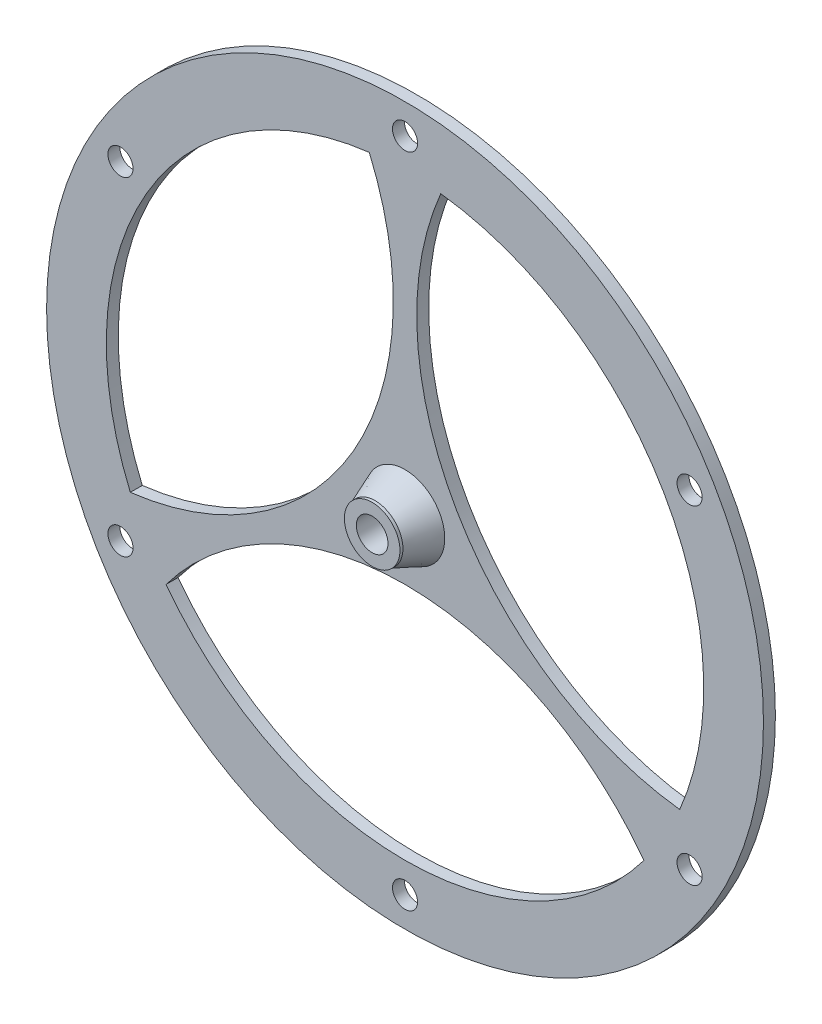
ISO-10303-21;
HEADER;
FILE_DESCRIPTION(('STEP AP214'),'2;1');
FILE_NAME('part.step','',(''),(''),'','','');
FILE_SCHEMA(('AUTOMOTIVE_DESIGN { 1 0 10303 214 1 1 1 1 }'));
ENDSEC;
DATA;
#1=APPLICATION_CONTEXT('core data for automotive mechanical design processes');
#2=APPLICATION_PROTOCOL_DEFINITION('international standard','automotive_design',2000,#1);
#3=PRODUCT_CONTEXT('',#1,'mechanical');
#4=PRODUCT('Part','Part','',(#3));
#5=PRODUCT_RELATED_PRODUCT_CATEGORY('part','',(#4));
#6=PRODUCT_DEFINITION_FORMATION('','',#4);
#7=PRODUCT_DEFINITION_CONTEXT('part definition',#1,'design');
#8=PRODUCT_DEFINITION('design','',#6,#7);
#9=PRODUCT_DEFINITION_SHAPE('','',#8);
#10=(LENGTH_UNIT() NAMED_UNIT(*) SI_UNIT(.MILLI.,.METRE.));
#11=(NAMED_UNIT(*) PLANE_ANGLE_UNIT() SI_UNIT($,.RADIAN.));
#12=(NAMED_UNIT(*) SI_UNIT($,.STERADIAN.) SOLID_ANGLE_UNIT());
#13=UNCERTAINTY_MEASURE_WITH_UNIT(LENGTH_MEASURE(1.E-05),#10,'distance_accuracy_value','');
#14=(GEOMETRIC_REPRESENTATION_CONTEXT(3) GLOBAL_UNCERTAINTY_ASSIGNED_CONTEXT((#13)) GLOBAL_UNIT_ASSIGNED_CONTEXT((#10,
#11,#12)) REPRESENTATION_CONTEXT('',''));
#15=CARTESIAN_POINT('',(0.,0.,0.));
#16=DIRECTION('',(0.,0.,1.));
#17=DIRECTION('',(1.,0.,0.));
#18=AXIS2_PLACEMENT_3D('',#15,#16,#17);
#19=CARTESIAN_POINT('',(0.,0.,2.));
#20=DIRECTION('',(0.,0.,1.));
#21=DIRECTION('',(1.,0.,0.));
#22=AXIS2_PLACEMENT_3D('',#19,#20,#21);
#23=PLANE('',#22);
#24=CARTESIAN_POINT('',(0.,0.,2.));
#25=DIRECTION('',(0.,0.,1.));
#26=DIRECTION('',(1.,0.,0.));
#27=AXIS2_PLACEMENT_3D('',#24,#25,#26);
#28=CIRCLE('',#27,6.64999999999999);
#29=CARTESIAN_POINT('',(6.64999999999999,0.,2.));
#30=VERTEX_POINT('',#29);
#31=EDGE_CURVE('E11',#30,#30,#28,.F.);
#32=ORIENTED_EDGE('',*,*,#31,.T.);
#33=EDGE_LOOP('',(#32));
#34=FACE_BOUND('',#33,.T.);
#35=CARTESIAN_POINT('',(0.,-60.,2.));
#36=DIRECTION('',(0.,0.,1.));
#37=DIRECTION('',(1.,0.,0.));
#38=AXIS2_PLACEMENT_3D('',#35,#36,#37);
#39=CIRCLE('',#38,50.);
#40=CARTESIAN_POINT('',(40.,-30.,2.));
#41=VERTEX_POINT('',#40);
#42=CARTESIAN_POINT('',(-40.,-30.,2.));
#43=VERTEX_POINT('',#42);
#44=EDGE_CURVE('E117',#41,#43,#39,.T.);
#45=ORIENTED_EDGE('',*,*,#44,.F.);
#46=CARTESIAN_POINT('',(0.,0.,2.));
#47=DIRECTION('',(0.,0.,1.));
#48=DIRECTION('',(1.,0.,0.));
#49=AXIS2_PLACEMENT_3D('',#46,#47,#48);
#50=CIRCLE('',#49,50.);
#51=EDGE_CURVE('E119',#43,#41,#50,.T.);
#52=ORIENTED_EDGE('',*,*,#51,.F.);
#53=EDGE_LOOP('',(#45,#52));
#54=FACE_BOUND('',#53,.T.);
#55=CARTESIAN_POINT('',(51.9615242270662,30.0000000000003,2.));
#56=DIRECTION('',(0.,0.,1.));
#57=DIRECTION('',(1.,0.,0.));
#58=AXIS2_PLACEMENT_3D('',#55,#56,#57);
#59=CIRCLE('',#58,50.);
#60=CARTESIAN_POINT('',(5.98076211353289,49.6410161513776,2.));
#61=VERTEX_POINT('',#60);
#62=CARTESIAN_POINT('',(45.9807621135333,-19.6410161513773,2.));
#63=VERTEX_POINT('',#62);
#64=EDGE_CURVE('E111',#61,#63,#59,.T.);
#65=ORIENTED_EDGE('',*,*,#64,.F.);
#66=CARTESIAN_POINT('',(0.,0.,2.));
#67=DIRECTION('',(0.,0.,1.));
#68=DIRECTION('',(1.,0.,0.));
#69=AXIS2_PLACEMENT_3D('',#66,#67,#68);
#70=CIRCLE('',#69,50.);
#71=EDGE_CURVE('E102',#63,#61,#70,.T.);
#72=ORIENTED_EDGE('',*,*,#71,.F.);
#73=EDGE_LOOP('',(#65,#72));
#74=FACE_BOUND('',#73,.T.);
#75=CARTESIAN_POINT('',(0.,0.,2.));
#76=DIRECTION('',(0.,0.,1.));
#77=DIRECTION('',(1.,0.,0.));
#78=AXIS2_PLACEMENT_3D('',#75,#76,#77);
#79=CIRCLE('',#78,60.);
#80=CARTESIAN_POINT('',(60.,0.,2.));
#81=VERTEX_POINT('',#80);
#82=EDGE_CURVE('E114',#81,#81,#79,.T.);
#83=ORIENTED_EDGE('',*,*,#82,.T.);
#84=EDGE_LOOP('',(#83));
#85=FACE_BOUND('',#84,.T.);
#86=CARTESIAN_POINT('',(-51.9615242270666,29.9999999999995,2.));
#87=DIRECTION('',(0.,0.,1.));
#88=DIRECTION('',(1.,0.,0.));
#89=AXIS2_PLACEMENT_3D('',#86,#87,#88);
#90=CIRCLE('',#89,50.);
#91=CARTESIAN_POINT('',(-45.980762113533,-19.641016151378,2.));
#92=VERTEX_POINT('',#91);
#93=CARTESIAN_POINT('',(-5.98076211353365,49.6410161513775,2.));
#94=VERTEX_POINT('',#93);
#95=EDGE_CURVE('E146',#92,#94,#90,.T.);
#96=ORIENTED_EDGE('',*,*,#95,.F.);
#97=CARTESIAN_POINT('',(0.,0.,2.));
#98=DIRECTION('',(0.,0.,1.));
#99=DIRECTION('',(1.,0.,0.));
#100=AXIS2_PLACEMENT_3D('',#97,#98,#99);
#101=CIRCLE('',#100,50.);
#102=EDGE_CURVE('E209',#94,#92,#101,.T.);
#103=ORIENTED_EDGE('',*,*,#102,.F.);
#104=EDGE_LOOP('',(#96,#103));
#105=FACE_BOUND('',#104,.T.);
#106=CARTESIAN_POINT('',(0.,55.,2.));
#107=DIRECTION('',(0.,0.,1.));
#108=DIRECTION('',(1.,0.,0.));
#109=AXIS2_PLACEMENT_3D('',#106,#107,#108);
#110=CIRCLE('',#109,2.1);
#111=CARTESIAN_POINT('',(2.1,55.,2.));
#112=VERTEX_POINT('',#111);
#113=EDGE_CURVE('E215',#112,#112,#110,.T.);
#114=ORIENTED_EDGE('',*,*,#113,.F.);
#115=EDGE_LOOP('',(#114));
#116=FACE_BOUND('',#115,.T.);
#117=CARTESIAN_POINT('',(-47.6313972081442,27.4999999999999,2.));
#118=DIRECTION('',(0.,0.,1.));
#119=DIRECTION('',(0.499999999999998,0.86602540378444,0.));
#120=AXIS2_PLACEMENT_3D('',#117,#118,#119);
#121=CIRCLE('',#120,2.1);
#122=CARTESIAN_POINT('',(-46.5813972081442,29.3186533479472,2.));
#123=VERTEX_POINT('',#122);
#124=EDGE_CURVE('E221',#123,#123,#121,.T.);
#125=ORIENTED_EDGE('',*,*,#124,.F.);
#126=EDGE_LOOP('',(#125));
#127=FACE_BOUND('',#126,.T.);
#128=CARTESIAN_POINT('',(-47.631397208144,-27.5000000000002,2.));
#129=DIRECTION('',(0.,0.,1.));
#130=DIRECTION('',(-0.500000000000004,0.866025403784436,0.));
#131=AXIS2_PLACEMENT_3D('',#128,#129,#130);
#132=CIRCLE('',#131,2.1);
#133=CARTESIAN_POINT('',(-48.681397208144,-25.6813466520529,2.));
#134=VERTEX_POINT('',#133);
#135=EDGE_CURVE('E246',#134,#134,#132,.T.);
#136=ORIENTED_EDGE('',*,*,#135,.F.);
#137=EDGE_LOOP('',(#136));
#138=FACE_BOUND('',#137,.T.);
#139=CARTESIAN_POINT('',(0.,-55.,2.));
#140=DIRECTION('',(0.,0.,1.));
#141=DIRECTION('',(-1.,0.,0.));
#142=AXIS2_PLACEMENT_3D('',#139,#140,#141);
#143=CIRCLE('',#142,2.1);
#144=CARTESIAN_POINT('',(-2.1,-55.,2.));
#145=VERTEX_POINT('',#144);
#146=EDGE_CURVE('E240',#145,#145,#143,.T.);
#147=ORIENTED_EDGE('',*,*,#146,.F.);
#148=EDGE_LOOP('',(#147));
#149=FACE_BOUND('',#148,.T.);
#150=CARTESIAN_POINT('',(47.6313972081444,-27.4999999999996,2.));
#151=DIRECTION('',(0.,0.,1.));
#152=DIRECTION('',(-0.499999999999992,-0.866025403784443,0.));
#153=AXIS2_PLACEMENT_3D('',#150,#151,#152);
#154=CIRCLE('',#153,2.1);
#155=CARTESIAN_POINT('',(46.5813972081444,-29.3186533479469,2.));
#156=VERTEX_POINT('',#155);
#157=EDGE_CURVE('E234',#156,#156,#154,.T.);
#158=ORIENTED_EDGE('',*,*,#157,.F.);
#159=EDGE_LOOP('',(#158));
#160=FACE_BOUND('',#159,.T.);
#161=CARTESIAN_POINT('',(47.6313972081438,27.5000000000006,2.));
#162=DIRECTION('',(0.,0.,1.));
#163=DIRECTION('',(0.50000000000001,-0.866025403784433,0.));
#164=AXIS2_PLACEMENT_3D('',#161,#162,#163);
#165=CIRCLE('',#164,2.1);
#166=CARTESIAN_POINT('',(48.6813972081438,25.6813466520533,2.));
#167=VERTEX_POINT('',#166);
#168=EDGE_CURVE('E227',#167,#167,#165,.T.);
#169=ORIENTED_EDGE('',*,*,#168,.F.);
#170=EDGE_LOOP('',(#169));
#171=FACE_BOUND('',#170,.T.);
#172=ADVANCED_FACE('F38',(#34,#54,#74,#85,#105,#116,#127,#138,#149,#160,#171),#23,.T.);
#173=CARTESIAN_POINT('',(0.,-60.,2.));
#174=DIRECTION('',(0.,0.,-1.));
#175=DIRECTION('',(-1.,0.,0.));
#176=AXIS2_PLACEMENT_3D('',#173,#174,#175);
#177=CYLINDRICAL_SURFACE('',#176,50.);
#178=CARTESIAN_POINT('',(0.,-60.,0.));
#179=DIRECTION('',(0.,0.,1.));
#180=DIRECTION('',(1.,0.,0.));
#181=AXIS2_PLACEMENT_3D('',#178,#179,#180);
#182=CIRCLE('',#181,50.);
#183=CARTESIAN_POINT('',(40.,-30.,0.));
#184=VERTEX_POINT('',#183);
#185=CARTESIAN_POINT('',(-40.,-30.,0.));
#186=VERTEX_POINT('',#185);
#187=EDGE_CURVE('E138',#184,#186,#182,.T.);
#188=ORIENTED_EDGE('',*,*,#187,.F.);
#189=DIRECTION('',(0.,0.,-1.));
#190=VECTOR('',#189,1.);
#191=CARTESIAN_POINT('',(40.,-30.,2.));
#192=LINE('',#191,#190);
#193=EDGE_CURVE('E76',#41,#184,#192,.T.);
#194=ORIENTED_EDGE('',*,*,#193,.F.);
#195=ORIENTED_EDGE('',*,*,#44,.T.);
#196=DIRECTION('',(0.,0.,-1.));
#197=VECTOR('',#196,1.);
#198=CARTESIAN_POINT('',(-40.,-30.,2.));
#199=LINE('',#198,#197);
#200=EDGE_CURVE('E56',#43,#186,#199,.T.);
#201=ORIENTED_EDGE('',*,*,#200,.T.);
#202=EDGE_LOOP('',(#188,#194,#195,#201));
#203=FACE_BOUND('',#202,.T.);
#204=ADVANCED_FACE('F166',(#203),#177,.F.);
#205=CARTESIAN_POINT('',(51.9615242270662,30.0000000000003,2.));
#206=DIRECTION('',(0.,0.,-1.));
#207=DIRECTION('',(-1.,0.,0.));
#208=AXIS2_PLACEMENT_3D('',#205,#206,#207);
#209=CYLINDRICAL_SURFACE('',#208,50.);
#210=CARTESIAN_POINT('',(51.9615242270662,30.0000000000003,0.));
#211=DIRECTION('',(0.,0.,1.));
#212=DIRECTION('',(1.,0.,0.));
#213=AXIS2_PLACEMENT_3D('',#210,#211,#212);
#214=CIRCLE('',#213,50.);
#215=CARTESIAN_POINT('',(5.98076211353289,49.6410161513776,0.));
#216=VERTEX_POINT('',#215);
#217=CARTESIAN_POINT('',(45.9807621135333,-19.6410161513773,0.));
#218=VERTEX_POINT('',#217);
#219=EDGE_CURVE('E135',#216,#218,#214,.T.);
#220=ORIENTED_EDGE('',*,*,#219,.F.);
#221=DIRECTION('',(0.,0.,-1.));
#222=VECTOR('',#221,1.);
#223=CARTESIAN_POINT('',(5.98076211353289,49.6410161513776,2.));
#224=LINE('',#223,#222);
#225=EDGE_CURVE('E108',#61,#216,#224,.T.);
#226=ORIENTED_EDGE('',*,*,#225,.F.);
#227=ORIENTED_EDGE('',*,*,#64,.T.);
#228=DIRECTION('',(0.,0.,-1.));
#229=VECTOR('',#228,1.);
#230=CARTESIAN_POINT('',(45.9807621135333,-19.6410161513773,2.));
#231=LINE('',#230,#229);
#232=EDGE_CURVE('E98',#63,#218,#231,.T.);
#233=ORIENTED_EDGE('',*,*,#232,.T.);
#234=EDGE_LOOP('',(#220,#226,#227,#233));
#235=FACE_BOUND('',#234,.T.);
#236=ADVANCED_FACE('F112',(#235),#209,.F.);
#237=CARTESIAN_POINT('',(-51.9615242270666,29.9999999999995,2.));
#238=DIRECTION('',(0.,0.,-1.));
#239=DIRECTION('',(-1.,0.,0.));
#240=AXIS2_PLACEMENT_3D('',#237,#238,#239);
#241=CYLINDRICAL_SURFACE('',#240,50.);
#242=CARTESIAN_POINT('',(-51.9615242270666,29.9999999999995,0.));
#243=DIRECTION('',(0.,0.,1.));
#244=DIRECTION('',(1.,0.,0.));
#245=AXIS2_PLACEMENT_3D('',#242,#243,#244);
#246=CIRCLE('',#245,50.);
#247=CARTESIAN_POINT('',(-45.980762113533,-19.641016151378,0.));
#248=VERTEX_POINT('',#247);
#249=CARTESIAN_POINT('',(-5.98076211353365,49.6410161513775,0.));
#250=VERTEX_POINT('',#249);
#251=EDGE_CURVE('E125',#248,#250,#246,.T.);
#252=ORIENTED_EDGE('',*,*,#251,.F.);
#253=DIRECTION('',(0.,0.,-1.));
#254=VECTOR('',#253,1.);
#255=CARTESIAN_POINT('',(-45.980762113533,-19.641016151378,2.));
#256=LINE('',#255,#254);
#257=EDGE_CURVE('E87',#92,#248,#256,.T.);
#258=ORIENTED_EDGE('',*,*,#257,.F.);
#259=ORIENTED_EDGE('',*,*,#95,.T.);
#260=DIRECTION('',(0.,0.,-1.));
#261=VECTOR('',#260,1.);
#262=CARTESIAN_POINT('',(-5.98076211353365,49.6410161513775,2.));
#263=LINE('',#262,#261);
#264=EDGE_CURVE('E124',#94,#250,#263,.T.);
#265=ORIENTED_EDGE('',*,*,#264,.T.);
#266=EDGE_LOOP('',(#252,#258,#259,#265));
#267=FACE_BOUND('',#266,.T.);
#268=ADVANCED_FACE('F189',(#267),#241,.F.);
#269=CARTESIAN_POINT('',(0.,0.,2.));
#270=DIRECTION('',(0.,0.,-1.));
#271=DIRECTION('',(-1.,0.,0.));
#272=AXIS2_PLACEMENT_3D('',#269,#270,#271);
#273=CYLINDRICAL_SURFACE('',#272,50.);
#274=CARTESIAN_POINT('',(0.,0.,0.));
#275=DIRECTION('',(0.,0.,1.));
#276=DIRECTION('',(1.,0.,0.));
#277=AXIS2_PLACEMENT_3D('',#274,#275,#276);
#278=CIRCLE('',#277,50.);
#279=EDGE_CURVE('E140',#186,#184,#278,.T.);
#280=ORIENTED_EDGE('',*,*,#279,.F.);
#281=ORIENTED_EDGE('',*,*,#200,.F.);
#282=ORIENTED_EDGE('',*,*,#51,.T.);
#283=ORIENTED_EDGE('',*,*,#193,.T.);
#284=EDGE_LOOP('',(#280,#281,#282,#283));
#285=FACE_BOUND('',#284,.T.);
#286=ADVANCED_FACE('F187',(#285),#273,.F.);
#287=CARTESIAN_POINT('',(0.,0.,2.));
#288=DIRECTION('',(0.,0.,-1.));
#289=DIRECTION('',(-1.,0.,0.));
#290=AXIS2_PLACEMENT_3D('',#287,#288,#289);
#291=CYLINDRICAL_SURFACE('',#290,50.);
#292=CARTESIAN_POINT('',(0.,0.,0.));
#293=DIRECTION('',(0.,0.,1.));
#294=DIRECTION('',(1.,0.,0.));
#295=AXIS2_PLACEMENT_3D('',#292,#293,#294);
#296=CIRCLE('',#295,50.);
#297=EDGE_CURVE('E104',#218,#216,#296,.T.);
#298=ORIENTED_EDGE('',*,*,#297,.F.);
#299=ORIENTED_EDGE('',*,*,#232,.F.);
#300=ORIENTED_EDGE('',*,*,#71,.T.);
#301=ORIENTED_EDGE('',*,*,#225,.T.);
#302=EDGE_LOOP('',(#298,#299,#300,#301));
#303=FACE_BOUND('',#302,.T.);
#304=ADVANCED_FACE('F100',(#303),#291,.F.);
#305=CARTESIAN_POINT('',(0.,0.,2.));
#306=DIRECTION('',(0.,0.,-1.));
#307=DIRECTION('',(-1.,0.,0.));
#308=AXIS2_PLACEMENT_3D('',#305,#306,#307);
#309=CYLINDRICAL_SURFACE('',#308,60.);
#310=ORIENTED_EDGE('',*,*,#82,.F.);
#311=EDGE_LOOP('',(#310));
#312=FACE_BOUND('',#311,.T.);
#313=CARTESIAN_POINT('',(0.,0.,0.));
#314=DIRECTION('',(0.,0.,1.));
#315=DIRECTION('',(1.,0.,0.));
#316=AXIS2_PLACEMENT_3D('',#313,#314,#315);
#317=CIRCLE('',#316,60.);
#318=CARTESIAN_POINT('',(60.,0.,0.));
#319=VERTEX_POINT('',#318);
#320=EDGE_CURVE('E132',#319,#319,#317,.T.);
#321=ORIENTED_EDGE('',*,*,#320,.T.);
#322=EDGE_LOOP('',(#321));
#323=FACE_BOUND('',#322,.T.);
#324=ADVANCED_FACE('F193',(#312,#323),#309,.T.);
#325=CARTESIAN_POINT('',(0.,0.,2.));
#326=DIRECTION('',(0.,0.,-1.));
#327=DIRECTION('',(-1.,0.,0.));
#328=AXIS2_PLACEMENT_3D('',#325,#326,#327);
#329=CYLINDRICAL_SURFACE('',#328,50.);
#330=CARTESIAN_POINT('',(0.,0.,0.));
#331=DIRECTION('',(0.,0.,1.));
#332=DIRECTION('',(1.,0.,0.));
#333=AXIS2_PLACEMENT_3D('',#330,#331,#332);
#334=CIRCLE('',#333,50.);
#335=EDGE_CURVE('E128',#250,#248,#334,.T.);
#336=ORIENTED_EDGE('',*,*,#335,.F.);
#337=ORIENTED_EDGE('',*,*,#264,.F.);
#338=ORIENTED_EDGE('',*,*,#102,.T.);
#339=ORIENTED_EDGE('',*,*,#257,.T.);
#340=EDGE_LOOP('',(#336,#337,#338,#339));
#341=FACE_BOUND('',#340,.T.);
#342=ADVANCED_FACE('F185',(#341),#329,.F.);
#343=CARTESIAN_POINT('',(0.,0.,2.));
#344=DIRECTION('',(0.,0.,-1.));
#345=DIRECTION('',(-1.,0.,0.));
#346=AXIS2_PLACEMENT_3D('',#343,#344,#345);
#347=CYLINDRICAL_SURFACE('',#346,2.65);
#348=CARTESIAN_POINT('',(0.,0.,0.));
#349=DIRECTION('',(0.,0.,1.));
#350=DIRECTION('',(1.,0.,0.));
#351=AXIS2_PLACEMENT_3D('',#348,#349,#350);
#352=CIRCLE('',#351,2.65);
#353=CARTESIAN_POINT('',(2.65,0.,0.));
#354=VERTEX_POINT('',#353);
#355=EDGE_CURVE('E143',#354,#354,#352,.T.);
#356=ORIENTED_EDGE('',*,*,#355,.F.);
#357=EDGE_LOOP('',(#356));
#358=FACE_BOUND('',#357,.T.);
#359=CARTESIAN_POINT('',(0.,0.,7.5));
#360=DIRECTION('',(0.,0.,1.));
#361=DIRECTION('',(1.,0.,0.));
#362=AXIS2_PLACEMENT_3D('',#359,#360,#361);
#363=CIRCLE('',#362,2.65);
#364=CARTESIAN_POINT('',(2.65,0.,7.5));
#365=VERTEX_POINT('',#364);
#366=EDGE_CURVE('E253',#365,#365,#363,.T.);
#367=ORIENTED_EDGE('',*,*,#366,.T.);
#368=EDGE_LOOP('',(#367));
#369=FACE_BOUND('',#368,.T.);
#370=ADVANCED_FACE('F181',(#358,#369),#347,.F.);
#371=CARTESIAN_POINT('',(0.,0.,0.));
#372=DIRECTION('',(0.,0.,1.));
#373=DIRECTION('',(1.,0.,0.));
#374=AXIS2_PLACEMENT_3D('',#371,#372,#373);
#375=PLANE('',#374);
#376=CARTESIAN_POINT('',(47.6313972081438,27.5000000000006,0.));
#377=DIRECTION('',(0.,0.,1.));
#378=DIRECTION('',(0.50000000000001,-0.866025403784433,0.));
#379=AXIS2_PLACEMENT_3D('',#376,#377,#378);
#380=CIRCLE('',#379,2.1);
#381=CARTESIAN_POINT('',(48.6813972081438,25.6813466520533,0.));
#382=VERTEX_POINT('',#381);
#383=EDGE_CURVE('E230',#382,#382,#380,.T.);
#384=ORIENTED_EDGE('',*,*,#383,.T.);
#385=EDGE_LOOP('',(#384));
#386=FACE_BOUND('',#385,.T.);
#387=CARTESIAN_POINT('',(47.6313972081444,-27.4999999999996,0.));
#388=DIRECTION('',(0.,0.,1.));
#389=DIRECTION('',(-0.499999999999992,-0.866025403784443,0.));
#390=AXIS2_PLACEMENT_3D('',#387,#388,#389);
#391=CIRCLE('',#390,2.1);
#392=CARTESIAN_POINT('',(46.5813972081444,-29.3186533479469,0.));
#393=VERTEX_POINT('',#392);
#394=EDGE_CURVE('E237',#393,#393,#391,.T.);
#395=ORIENTED_EDGE('',*,*,#394,.T.);
#396=EDGE_LOOP('',(#395));
#397=FACE_BOUND('',#396,.T.);
#398=CARTESIAN_POINT('',(0.,-55.,0.));
#399=DIRECTION('',(0.,0.,1.));
#400=DIRECTION('',(-1.,0.,0.));
#401=AXIS2_PLACEMENT_3D('',#398,#399,#400);
#402=CIRCLE('',#401,2.1);
#403=CARTESIAN_POINT('',(-2.1,-55.,0.));
#404=VERTEX_POINT('',#403);
#405=EDGE_CURVE('E243',#404,#404,#402,.T.);
#406=ORIENTED_EDGE('',*,*,#405,.T.);
#407=EDGE_LOOP('',(#406));
#408=FACE_BOUND('',#407,.T.);
#409=CARTESIAN_POINT('',(-47.631397208144,-27.5000000000002,0.));
#410=DIRECTION('',(0.,0.,1.));
#411=DIRECTION('',(-0.500000000000004,0.866025403784436,0.));
#412=AXIS2_PLACEMENT_3D('',#409,#410,#411);
#413=CIRCLE('',#412,2.1);
#414=CARTESIAN_POINT('',(-48.681397208144,-25.6813466520529,0.));
#415=VERTEX_POINT('',#414);
#416=EDGE_CURVE('E224',#415,#415,#413,.T.);
#417=ORIENTED_EDGE('',*,*,#416,.T.);
#418=EDGE_LOOP('',(#417));
#419=FACE_BOUND('',#418,.T.);
#420=CARTESIAN_POINT('',(-47.6313972081442,27.4999999999999,0.));
#421=DIRECTION('',(0.,0.,1.));
#422=DIRECTION('',(0.499999999999998,0.86602540378444,0.));
#423=AXIS2_PLACEMENT_3D('',#420,#421,#422);
#424=CIRCLE('',#423,2.1);
#425=CARTESIAN_POINT('',(-46.5813972081442,29.3186533479472,0.));
#426=VERTEX_POINT('',#425);
#427=EDGE_CURVE('E218',#426,#426,#424,.T.);
#428=ORIENTED_EDGE('',*,*,#427,.T.);
#429=EDGE_LOOP('',(#428));
#430=FACE_BOUND('',#429,.T.);
#431=CARTESIAN_POINT('',(0.,55.,0.));
#432=DIRECTION('',(0.,0.,1.));
#433=DIRECTION('',(1.,0.,0.));
#434=AXIS2_PLACEMENT_3D('',#431,#432,#433);
#435=CIRCLE('',#434,2.1);
#436=CARTESIAN_POINT('',(2.1,55.,0.));
#437=VERTEX_POINT('',#436);
#438=EDGE_CURVE('E129',#437,#437,#435,.T.);
#439=ORIENTED_EDGE('',*,*,#438,.T.);
#440=EDGE_LOOP('',(#439));
#441=FACE_BOUND('',#440,.T.);
#442=ORIENTED_EDGE('',*,*,#251,.T.);
#443=ORIENTED_EDGE('',*,*,#335,.T.);
#444=EDGE_LOOP('',(#442,#443));
#445=FACE_BOUND('',#444,.T.);
#446=ORIENTED_EDGE('',*,*,#320,.F.);
#447=EDGE_LOOP('',(#446));
#448=FACE_BOUND('',#447,.T.);
#449=ORIENTED_EDGE('',*,*,#219,.T.);
#450=ORIENTED_EDGE('',*,*,#297,.T.);
#451=EDGE_LOOP('',(#449,#450));
#452=FACE_BOUND('',#451,.T.);
#453=ORIENTED_EDGE('',*,*,#187,.T.);
#454=ORIENTED_EDGE('',*,*,#279,.T.);
#455=EDGE_LOOP('',(#453,#454));
#456=FACE_BOUND('',#455,.T.);
#457=ORIENTED_EDGE('',*,*,#355,.T.);
#458=EDGE_LOOP('',(#457));
#459=FACE_BOUND('',#458,.T.);
#460=ADVANCED_FACE('F178',(#386,#397,#408,#419,#430,#441,#445,#448,#452,#456,#459),#375,.F.);
#461=CARTESIAN_POINT('',(0.,55.,0.));
#462=DIRECTION('',(0.,0.,1.));
#463=DIRECTION('',(1.,0.,0.));
#464=AXIS2_PLACEMENT_3D('',#461,#462,#463);
#465=CYLINDRICAL_SURFACE('',#464,2.1);
#466=ORIENTED_EDGE('',*,*,#438,.F.);
#467=EDGE_LOOP('',(#466));
#468=FACE_BOUND('',#467,.T.);
#469=ORIENTED_EDGE('',*,*,#113,.T.);
#470=EDGE_LOOP('',(#469));
#471=FACE_BOUND('',#470,.T.);
#472=ADVANCED_FACE('F176',(#468,#471),#465,.F.);
#473=CARTESIAN_POINT('',(-47.6313972081442,27.4999999999999,0.));
#474=DIRECTION('',(0.,0.,1.));
#475=DIRECTION('',(1.,0.,0.));
#476=AXIS2_PLACEMENT_3D('',#473,#474,#475);
#477=CYLINDRICAL_SURFACE('',#476,2.1);
#478=ORIENTED_EDGE('',*,*,#427,.F.);
#479=EDGE_LOOP('',(#478));
#480=FACE_BOUND('',#479,.T.);
#481=ORIENTED_EDGE('',*,*,#124,.T.);
#482=EDGE_LOOP('',(#481));
#483=FACE_BOUND('',#482,.T.);
#484=ADVANCED_FACE('F273',(#480,#483),#477,.F.);
#485=CARTESIAN_POINT('',(-47.631397208144,-27.5000000000002,0.));
#486=DIRECTION('',(0.,0.,1.));
#487=DIRECTION('',(1.,0.,0.));
#488=AXIS2_PLACEMENT_3D('',#485,#486,#487);
#489=CYLINDRICAL_SURFACE('',#488,2.1);
#490=ORIENTED_EDGE('',*,*,#416,.F.);
#491=EDGE_LOOP('',(#490));
#492=FACE_BOUND('',#491,.T.);
#493=ORIENTED_EDGE('',*,*,#135,.T.);
#494=EDGE_LOOP('',(#493));
#495=FACE_BOUND('',#494,.T.);
#496=ADVANCED_FACE('F269',(#492,#495),#489,.F.);
#497=CARTESIAN_POINT('',(0.,-55.,0.));
#498=DIRECTION('',(0.,0.,1.));
#499=DIRECTION('',(1.,0.,0.));
#500=AXIS2_PLACEMENT_3D('',#497,#498,#499);
#501=CYLINDRICAL_SURFACE('',#500,2.1);
#502=ORIENTED_EDGE('',*,*,#405,.F.);
#503=EDGE_LOOP('',(#502));
#504=FACE_BOUND('',#503,.T.);
#505=ORIENTED_EDGE('',*,*,#146,.T.);
#506=EDGE_LOOP('',(#505));
#507=FACE_BOUND('',#506,.T.);
#508=ADVANCED_FACE('F272',(#504,#507),#501,.F.);
#509=CARTESIAN_POINT('',(47.6313972081444,-27.4999999999996,0.));
#510=DIRECTION('',(0.,0.,1.));
#511=DIRECTION('',(1.,0.,0.));
#512=AXIS2_PLACEMENT_3D('',#509,#510,#511);
#513=CYLINDRICAL_SURFACE('',#512,2.1);
#514=ORIENTED_EDGE('',*,*,#394,.F.);
#515=EDGE_LOOP('',(#514));
#516=FACE_BOUND('',#515,.T.);
#517=ORIENTED_EDGE('',*,*,#157,.T.);
#518=EDGE_LOOP('',(#517));
#519=FACE_BOUND('',#518,.T.);
#520=ADVANCED_FACE('F265',(#516,#519),#513,.F.);
#521=CARTESIAN_POINT('',(47.6313972081438,27.5000000000006,0.));
#522=DIRECTION('',(0.,0.,1.));
#523=DIRECTION('',(1.,0.,0.));
#524=AXIS2_PLACEMENT_3D('',#521,#522,#523);
#525=CYLINDRICAL_SURFACE('',#524,2.1);
#526=ORIENTED_EDGE('',*,*,#383,.F.);
#527=EDGE_LOOP('',(#526));
#528=FACE_BOUND('',#527,.T.);
#529=ORIENTED_EDGE('',*,*,#168,.T.);
#530=EDGE_LOOP('',(#529));
#531=FACE_BOUND('',#530,.T.);
#532=ADVANCED_FACE('F259',(#528,#531),#525,.F.);
#533=CARTESIAN_POINT('',(0.,0.,7.5));
#534=DIRECTION('',(0.,0.,1.));
#535=DIRECTION('',(1.,0.,0.));
#536=AXIS2_PLACEMENT_3D('',#533,#534,#535);
#537=PLANE('',#536);
#538=CARTESIAN_POINT('',(0.,0.,7.5));
#539=DIRECTION('',(0.,0.,1.));
#540=DIRECTION('',(1.,0.,0.));
#541=AXIS2_PLACEMENT_3D('',#538,#539,#540);
#542=CIRCLE('',#541,4.65);
#543=CARTESIAN_POINT('',(4.65,0.,7.5));
#544=VERTEX_POINT('',#543);
#545=EDGE_CURVE('E231',#544,#544,#542,.T.);
#546=ORIENTED_EDGE('',*,*,#545,.T.);
#547=EDGE_LOOP('',(#546));
#548=FACE_BOUND('',#547,.T.);
#549=ORIENTED_EDGE('',*,*,#366,.F.);
#550=EDGE_LOOP('',(#549));
#551=FACE_BOUND('',#550,.T.);
#552=ADVANCED_FACE('F162',(#548,#551),#537,.T.);
#553=CARTESIAN_POINT('',(0.,0.,7.5));
#554=DIRECTION('',(0.,0.,-1.));
#555=DIRECTION('',(-1.,0.,0.));
#556=AXIS2_PLACEMENT_3D('',#553,#554,#555);
#557=CYLINDRICAL_SURFACE('',#556,4.65);
#558=CARTESIAN_POINT('',(0.,0.,6.99999999999998));
#559=DIRECTION('',(0.,0.,1.));
#560=DIRECTION('',(1.,0.,0.));
#561=AXIS2_PLACEMENT_3D('',#558,#559,#560);
#562=CIRCLE('',#561,4.65);
#563=CARTESIAN_POINT('',(4.65,0.,6.99999999999998));
#564=VERTEX_POINT('',#563);
#565=EDGE_CURVE('E48',#564,#564,#562,.T.);
#566=ORIENTED_EDGE('',*,*,#565,.T.);
#567=EDGE_LOOP('',(#566));
#568=FACE_BOUND('',#567,.T.);
#569=ORIENTED_EDGE('',*,*,#545,.F.);
#570=EDGE_LOOP('',(#569));
#571=FACE_BOUND('',#570,.T.);
#572=ADVANCED_FACE('F154',(#568,#571),#557,.T.);
#573=CARTESIAN_POINT('',(0.,0.,6.99999999999998));
#574=DIRECTION('',(0.,0.,-1.));
#575=DIRECTION('',(-1.,0.,0.));
#576=AXIS2_PLACEMENT_3D('',#573,#574,#575);
#577=CONICAL_SURFACE('',#576,4.65,0.380506377112365);
#578=ORIENTED_EDGE('',*,*,#31,.F.);
#579=EDGE_LOOP('',(#578));
#580=FACE_BOUND('',#579,.T.);
#581=ORIENTED_EDGE('',*,*,#565,.F.);
#582=EDGE_LOOP('',(#581));
#583=FACE_BOUND('',#582,.T.);
#584=ADVANCED_FACE('F41',(#580,#583),#577,.T.);
#585=CLOSED_SHELL('',(#172,#204,#236,#268,#286,#304,#324,#342,#370,#460,#472,#484,#496,#508,
#520,#532,#552,#572,#584));
#586=MANIFOLD_SOLID_BREP('B2',#585);
#587=ADVANCED_BREP_SHAPE_REPRESENTATION('',(#18,#586),#14);
#588=SHAPE_DEFINITION_REPRESENTATION(#9,#587);
ENDSEC;
END-ISO-10303-21;
